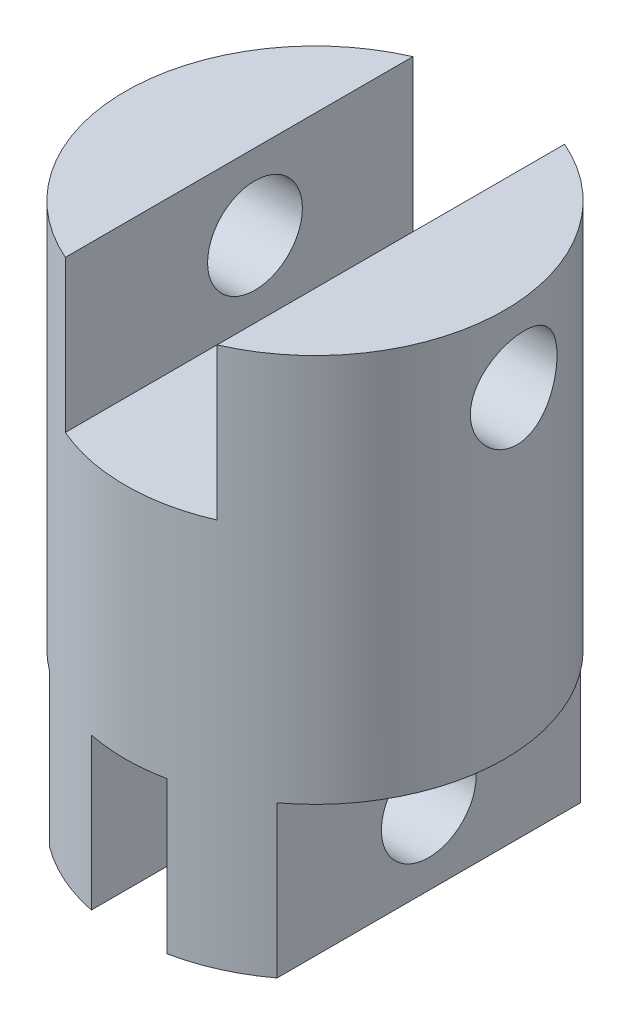
ISO-10303-21;
HEADER;
FILE_DESCRIPTION(('STEP AP214'),'2;1');
FILE_NAME('part.step','',(''),(''),'','','');
FILE_SCHEMA(('AUTOMOTIVE_DESIGN { 1 0 10303 214 1 1 1 1 }'));
ENDSEC;
DATA;
#1=APPLICATION_CONTEXT('core data for automotive mechanical design processes');
#2=APPLICATION_PROTOCOL_DEFINITION('international standard','automotive_design',2000,#1);
#3=PRODUCT_CONTEXT('',#1,'mechanical');
#4=PRODUCT('Part','Part','',(#3));
#5=PRODUCT_RELATED_PRODUCT_CATEGORY('part','',(#4));
#6=PRODUCT_DEFINITION_FORMATION('','',#4);
#7=PRODUCT_DEFINITION_CONTEXT('part definition',#1,'design');
#8=PRODUCT_DEFINITION('design','',#6,#7);
#9=PRODUCT_DEFINITION_SHAPE('','',#8);
#10=(LENGTH_UNIT() NAMED_UNIT(*) SI_UNIT(.MILLI.,.METRE.));
#11=(NAMED_UNIT(*) PLANE_ANGLE_UNIT() SI_UNIT($,.RADIAN.));
#12=(NAMED_UNIT(*) SI_UNIT($,.STERADIAN.) SOLID_ANGLE_UNIT());
#13=UNCERTAINTY_MEASURE_WITH_UNIT(LENGTH_MEASURE(1.E-05),#10,'distance_accuracy_value','');
#14=(GEOMETRIC_REPRESENTATION_CONTEXT(3) GLOBAL_UNCERTAINTY_ASSIGNED_CONTEXT((#13)) GLOBAL_UNIT_ASSIGNED_CONTEXT((#10,
#11,#12)) REPRESENTATION_CONTEXT('',''));
#15=CARTESIAN_POINT('',(0.,0.,0.));
#16=DIRECTION('',(0.,0.,1.));
#17=DIRECTION('',(1.,0.,0.));
#18=AXIS2_PLACEMENT_3D('',#15,#16,#17);
#19=CARTESIAN_POINT('',(0.,10.16,0.));
#20=DIRECTION('',(0.,-1.,0.));
#21=DIRECTION('',(0.,0.,-1.));
#22=AXIS2_PLACEMENT_3D('',#19,#20,#21);
#23=PLANE('',#22);
#24=CARTESIAN_POINT('',(0.,10.16,0.));
#25=DIRECTION('',(0.,-1.,0.));
#26=DIRECTION('',(0.,0.,-1.));
#27=AXIS2_PLACEMENT_3D('',#24,#25,#26);
#28=CIRCLE('',#27,2.54);
#29=CARTESIAN_POINT('',(2.54,10.16,0.));
#30=VERTEX_POINT('',#29);
#31=CARTESIAN_POINT('',(-2.54,10.16,0.));
#32=VERTEX_POINT('',#31);
#33=EDGE_CURVE('E57',#30,#32,#28,.T.);
#34=ORIENTED_EDGE('',*,*,#33,.F.);
#35=DIRECTION('',(0.,0.,1.));
#36=VECTOR('',#35,1.);
#37=CARTESIAN_POINT('',(2.54,10.16,12.4434078933385));
#38=LINE('',#37,#36);
#39=CARTESIAN_POINT('',(2.54,10.16,12.4434078933385));
#40=VERTEX_POINT('',#39);
#41=EDGE_CURVE('E148',#30,#40,#38,.T.);
#42=ORIENTED_EDGE('',*,*,#41,.T.);
#43=CARTESIAN_POINT('',(0.,10.16,0.));
#44=DIRECTION('',(0.,-1.,0.));
#45=DIRECTION('',(0.,0.,-1.));
#46=AXIS2_PLACEMENT_3D('',#43,#44,#45);
#47=CIRCLE('',#46,12.7);
#48=CARTESIAN_POINT('',(-2.54,10.16,12.4434078933385));
#49=VERTEX_POINT('',#48);
#50=EDGE_CURVE('E180',#40,#49,#47,.T.);
#51=ORIENTED_EDGE('',*,*,#50,.T.);
#52=DIRECTION('',(0.,0.,-1.));
#53=VECTOR('',#52,1.);
#54=CARTESIAN_POINT('',(-2.54,10.16,12.4434078933385));
#55=LINE('',#54,#53);
#56=EDGE_CURVE('E150',#49,#32,#55,.T.);
#57=ORIENTED_EDGE('',*,*,#56,.T.);
#58=EDGE_LOOP('',(#34,#42,#51,#57));
#59=FACE_BOUND('',#58,.T.);
#60=ADVANCED_FACE('F39',(#59),#23,.T.);
#61=CARTESIAN_POINT('',(0.,0.,0.));
#62=DIRECTION('',(0.,1.,0.));
#63=DIRECTION('',(0.,0.,1.));
#64=AXIS2_PLACEMENT_3D('',#61,#62,#63);
#65=PLANE('',#64);
#66=CARTESIAN_POINT('',(0.,0.,0.));
#67=DIRECTION('',(0.,1.,0.));
#68=DIRECTION('',(0.,0.,1.));
#69=AXIS2_PLACEMENT_3D('',#66,#67,#68);
#70=CIRCLE('',#69,12.7);
#71=CARTESIAN_POINT('',(7.62,0.,-10.16));
#72=VERTEX_POINT('',#71);
#73=CARTESIAN_POINT('',(2.54,0.,-12.4434078933385));
#74=VERTEX_POINT('',#73);
#75=EDGE_CURVE('E228',#72,#74,#70,.T.);
#76=ORIENTED_EDGE('',*,*,#75,.F.);
#77=DIRECTION('',(0.,0.,-1.));
#78=VECTOR('',#77,1.);
#79=CARTESIAN_POINT('',(7.62,0.,10.16));
#80=LINE('',#79,#78);
#81=CARTESIAN_POINT('',(7.62,0.,10.16));
#82=VERTEX_POINT('',#81);
#83=EDGE_CURVE('E462',#82,#72,#80,.T.);
#84=ORIENTED_EDGE('',*,*,#83,.F.);
#85=CARTESIAN_POINT('',(2.54,0.,12.4434078933385));
#86=VERTEX_POINT('',#85);
#87=EDGE_CURVE('E225',#86,#82,#70,.T.);
#88=ORIENTED_EDGE('',*,*,#87,.F.);
#89=DIRECTION('',(0.,0.,1.));
#90=VECTOR('',#89,1.);
#91=CARTESIAN_POINT('',(2.54,0.,12.4434078933385));
#92=LINE('',#91,#90);
#93=EDGE_CURVE('E176',#74,#86,#92,.T.);
#94=ORIENTED_EDGE('',*,*,#93,.F.);
#95=EDGE_LOOP('',(#76,#84,#88,#94));
#96=FACE_BOUND('',#95,.T.);
#97=ADVANCED_FACE('F321',(#96),#65,.F.);
#98=CARTESIAN_POINT('',(0.,36.195,0.));
#99=DIRECTION('',(0.,1.,0.));
#100=DIRECTION('',(0.,0.,1.));
#101=AXIS2_PLACEMENT_3D('',#98,#99,#100);
#102=PLANE('',#101);
#103=DIRECTION('',(0.,0.,-1.));
#104=VECTOR('',#103,1.);
#105=CARTESIAN_POINT('',(5.08,36.195,-11.6397422651878));
#106=LINE('',#105,#104);
#107=CARTESIAN_POINT('',(5.08,36.195,11.6397422651878));
#108=VERTEX_POINT('',#107);
#109=CARTESIAN_POINT('',(5.08,36.195,-11.6397422651878));
#110=VERTEX_POINT('',#109);
#111=EDGE_CURVE('E195',#108,#110,#106,.T.);
#112=ORIENTED_EDGE('',*,*,#111,.F.);
#113=CARTESIAN_POINT('',(0.,36.195,0.));
#114=DIRECTION('',(0.,1.,0.));
#115=DIRECTION('',(0.,0.,1.));
#116=AXIS2_PLACEMENT_3D('',#113,#114,#115);
#117=CIRCLE('',#116,12.7);
#118=EDGE_CURVE('E11',#108,#110,#117,.T.);
#119=ORIENTED_EDGE('',*,*,#118,.T.);
#120=EDGE_LOOP('',(#112,#119));
#121=FACE_BOUND('',#120,.T.);
#122=ADVANCED_FACE('F318',(#121),#102,.T.);
#123=CARTESIAN_POINT('',(0.,36.195,0.));
#124=DIRECTION('',(0.,-1.,0.));
#125=DIRECTION('',(0.,0.,-1.));
#126=AXIS2_PLACEMENT_3D('',#123,#124,#125);
#127=CYLINDRICAL_SURFACE('',#126,12.7);
#128=CARTESIAN_POINT('',(-11.9729942754398,31.115,-4.23525773481216));
#129=CARTESIAN_POINT('',(-11.972998143231,31.2874088699792,-4.23525262688047));
#130=CARTESIAN_POINT('',(-11.9780095636609,31.4598716387249,-4.22116033774055));
#131=CARTESIAN_POINT('',(-11.9975381000863,31.7997584861729,-4.16532368016898));
#132=CARTESIAN_POINT('',(-12.0120610453909,31.9671794090304,-4.12356235408763));
#133=CARTESIAN_POINT('',(-12.0491026709913,32.2919317790422,-4.01402947263172));
#134=CARTESIAN_POINT('',(-12.0716053634372,32.4492826632751,-3.94630990417966));
#135=CARTESIAN_POINT('',(-12.1225134772368,32.7503390160573,-3.78703436072692));
#136=CARTESIAN_POINT('',(-12.1509195001857,32.8940430917147,-3.69547595612358));
#137=CARTESIAN_POINT('',(-12.2122375809538,33.1691029113475,-3.48760053710267));
#138=CARTESIAN_POINT('',(-12.2452690772457,33.2998806252469,-3.37055424702534));
#139=CARTESIAN_POINT('',(-12.3123252460539,33.5403286539601,-3.11670719723422));
#140=CARTESIAN_POINT('',(-12.3463501304767,33.6499944267882,-2.97990219772202));
#141=CARTESIAN_POINT('',(-12.4140105681662,33.8491575820938,-2.68442175676774));
#142=CARTESIAN_POINT('',(-12.4475844555828,33.9377519929203,-2.52512166018005));
#143=CARTESIAN_POINT('',(-12.5103683585746,34.0866406837887,-2.19299145152488));
#144=CARTESIAN_POINT('',(-12.5395787008088,34.1469370829698,-2.02016235372833));
#145=CARTESIAN_POINT('',(-12.5912063595523,34.2364781383189,-1.66815006049136));
#146=CARTESIAN_POINT('',(-12.6137091771629,34.2661266877327,-1.48908253104349));
#147=CARTESIAN_POINT('',(-12.6511326430744,34.2944481565371,-1.1277414626017));
#148=CARTESIAN_POINT('',(-12.6660551405096,34.2931286339528,-0.945468716719796));
#149=CARTESIAN_POINT('',(-12.687502188702,34.2598511538941,-0.589839174381925));
#150=CARTESIAN_POINT('',(-12.6943071431202,34.2289870590439,-0.416396168961094));
#151=CARTESIAN_POINT('',(-12.7009025881474,34.1389764996355,-0.0768813485584305));
#152=CARTESIAN_POINT('',(-12.7006934320317,34.0798314596344,0.0891908372431004));
#153=CARTESIAN_POINT('',(-12.6944494619133,33.9357231123991,0.407517676618822));
#154=CARTESIAN_POINT('',(-12.6884746565015,33.8510319251207,0.559897000299652));
#155=CARTESIAN_POINT('',(-12.6724411871112,33.6580173315897,0.848629743854683));
#156=CARTESIAN_POINT('',(-12.6623820966837,33.5496914581356,0.984981488337508));
#157=CARTESIAN_POINT('',(-12.6399450023049,33.3101932038052,1.24038360272859));
#158=CARTESIAN_POINT('',(-12.6275283040183,33.1786426207541,1.35907594892826));
#159=CARTESIAN_POINT('',(-12.6026728394593,32.8976575725586,1.57297969164506));
#160=CARTESIAN_POINT('',(-12.5902340715162,32.7482216911472,1.66818922682034));
#161=CARTESIAN_POINT('',(-12.5672199973432,32.4334267897036,1.83359700425444));
#162=CARTESIAN_POINT('',(-12.5566712082812,32.267884979229,1.90345162147138));
#163=CARTESIAN_POINT('',(-12.5393663956625,31.9272224799968,2.01431517082349));
#164=CARTESIAN_POINT('',(-12.5326100674525,31.7521025619015,2.05532642005016));
#165=CARTESIAN_POINT('',(-12.5240252803999,31.3989317891139,2.10700764995979));
#166=CARTESIAN_POINT('',(-12.522153025896,31.2209214875656,2.11794733148771));
#167=CARTESIAN_POINT('',(-12.5235086908234,30.8656030271458,2.10991610891844));
#168=CARTESIAN_POINT('',(-12.5267363756075,30.6882948363465,2.09094658093822));
#169=CARTESIAN_POINT('',(-12.5377268415192,30.3410100405939,2.02398769375489));
#170=CARTESIAN_POINT('',(-12.5454499157718,30.1709830646111,1.97625228912676));
#171=CARTESIAN_POINT('',(-12.5641869147956,29.8413252293486,1.85338715501724));
#172=CARTESIAN_POINT('',(-12.5752011002728,29.6816951948851,1.77825525521383));
#173=CARTESIAN_POINT('',(-12.5988907917401,29.3756564931445,1.60184793217612));
#174=CARTESIAN_POINT('',(-12.6115813872154,29.2293912167403,1.50032579832561));
#175=CARTESIAN_POINT('',(-12.6364209016814,28.9558111156719,1.2742697449463));
#176=CARTESIAN_POINT('',(-12.6485697858979,28.8284975063512,1.14973435075678));
#177=CARTESIAN_POINT('',(-12.6702082162522,28.5953996482611,0.879916130503364));
#178=CARTESIAN_POINT('',(-12.6796754232026,28.4897981524221,0.734473411430738));
#179=CARTESIAN_POINT('',(-12.6937232389071,28.30453513765,0.427697125983251));
#180=CARTESIAN_POINT('',(-12.6983044337287,28.2248705084367,0.266365467992195));
#181=CARTESIAN_POINT('',(-12.7008980430661,28.094824968811,-0.0650697601117363));
#182=CARTESIAN_POINT('',(-12.6990041825368,28.0440385379158,-0.235013384830995));
#183=CARTESIAN_POINT('',(-12.6878929986898,27.9714548363163,-0.580738734568134));
#184=CARTESIAN_POINT('',(-12.6786765922946,27.9496539369839,-0.756519725995769));
#185=CARTESIAN_POINT('',(-12.6529653817535,27.935600178195,-1.1057164000628));
#186=CARTESIAN_POINT('',(-12.6365960407779,27.9428548441381,-1.27912193352732));
#187=CARTESIAN_POINT('',(-12.59721521882,27.9852707172644,-1.62170024605938));
#188=CARTESIAN_POINT('',(-12.5742033046118,28.0204337448816,-1.79087274826802));
#189=CARTESIAN_POINT('',(-12.5224926694032,28.1179703905291,-2.12267503769202));
#190=CARTESIAN_POINT('',(-12.4937243107253,28.1806897277952,-2.28519204203511));
#191=CARTESIAN_POINT('',(-12.4325932636365,28.3314430144316,-2.59729627846604));
#192=CARTESIAN_POINT('',(-12.4002298338348,28.4194821913372,-2.74688083221638));
#193=CARTESIAN_POINT('',(-12.3330308914859,28.6221011764706,-3.03462778093435));
#194=CARTESIAN_POINT('',(-12.2981483693459,28.7375166716735,-3.17219133352036));
#195=CARTESIAN_POINT('',(-12.2298307621258,28.9900965872704,-3.42615995674051));
#196=CARTESIAN_POINT('',(-12.1963960793602,29.1272670040099,-3.54255917477123));
#197=CARTESIAN_POINT('',(-12.1335200021671,29.4219016201651,-3.75231479730335));
#198=CARTESIAN_POINT('',(-12.1041368862798,29.5796089122513,-3.84534814010752));
#199=CARTESIAN_POINT('',(-12.0528509525061,29.9095931028246,-4.00321468640624));
#200=CARTESIAN_POINT('',(-12.030940906053,30.081855719757,-4.06807515772458));
#201=CARTESIAN_POINT('',(-12.0006301947048,30.3975903861465,-4.15650574206976));
#202=CARTESIAN_POINT('',(-11.9903349869687,30.5392581586002,-4.18596434639092));
#203=CARTESIAN_POINT('',(-11.9765158960221,30.825604922851,-4.22534106682629));
#204=CARTESIAN_POINT('',(-11.9729910288939,30.970283474009,-4.23526202230693));
#205=CARTESIAN_POINT('',(-11.9729942754398,31.115,-4.23525773481216));
#206=B_SPLINE_CURVE_WITH_KNOTS('',3,(#128,#129,#130,#131,#132,#133,#134,#135,#136,#137,#138,
#139,#140,#141,#142,#143,#144,#145,#146,#147,#148,#149,#150,#151,#152,#153,#154,#155,#156,#157,
#158,#159,#160,#161,#162,#163,#164,#165,#166,#167,#168,#169,#170,#171,#172,#173,#174,#175,#176,
#177,#178,#179,#180,#181,#182,#183,#184,#185,#186,#187,#188,#189,#190,#191,#192,#193,#194,#195,
#196,#197,#198,#199,#200,#201,#202,#203,#204,#205),.UNSPECIFIED.,.T.,.F.,(4,2,2,2,2,2,2,2,2,2,2,
2,2,2,2,2,2,2,2,2,2,2,2,2,2,2,2,2,2,2,2,2,2,2,2,2,2,2,4),(0.,0.516685442722757,1.03368784210839,
1.54966019823545,2.06568516174838,2.59906942859475,3.13256831886256,3.68593121279239,
4.23925266069452,4.78518541322278,5.33098492753712,5.85732801387331,6.38364459024897,
6.90454171957706,7.42549325087814,7.95587865801775,8.48630609213286,9.02367514821774,
9.56100103058096,10.0934918632431,10.6259581968198,11.1537912344129,11.6816660954809,
12.2146653543448,12.7476987789798,13.2850500469275,13.8223368533809,14.3518796785743,
14.881356205347,15.4018967209428,15.9224711936572,16.4497720436397,16.9771818384299,
17.523430357678,18.0698297028281,18.6234125385423,19.1764583747285,19.6102167497306,
20.0439120828648),.UNSPECIFIED.);
#207=CARTESIAN_POINT('',(-11.9729942754398,31.115,-4.23525773481216));
#208=VERTEX_POINT('',#207);
#209=EDGE_CURVE('E261',#208,#208,#206,.T.);
#210=ORIENTED_EDGE('',*,*,#209,.T.);
#211=EDGE_LOOP('',(#210));
#212=FACE_BOUND('',#211,.T.);
#213=CARTESIAN_POINT('',(11.9729942754398,31.115,-4.23525773481216));
#214=CARTESIAN_POINT('',(11.972998143231,30.9425911300207,-4.23525262688047));
#215=CARTESIAN_POINT('',(11.9780095636609,30.7701283612751,-4.22116033774055));
#216=CARTESIAN_POINT('',(11.9975381000863,30.4302415138271,-4.16532368016898));
#217=CARTESIAN_POINT('',(12.0120610453909,30.2628205909696,-4.12356235408763));
#218=CARTESIAN_POINT('',(12.0491026709913,29.9380682209578,-4.01402947263172));
#219=CARTESIAN_POINT('',(12.0716053634372,29.7807173367249,-3.94630990417966));
#220=CARTESIAN_POINT('',(12.1225134772368,29.4796609839427,-3.78703436072692));
#221=CARTESIAN_POINT('',(12.1509195001857,29.3359569082853,-3.69547595612358));
#222=CARTESIAN_POINT('',(12.2122375809538,29.0608970886524,-3.48760053710267));
#223=CARTESIAN_POINT('',(12.2452690772457,28.9301193747531,-3.37055424702534));
#224=CARTESIAN_POINT('',(12.3123252460539,28.6896713460399,-3.11670719723422));
#225=CARTESIAN_POINT('',(12.3463501304767,28.5800055732118,-2.97990219772201));
#226=CARTESIAN_POINT('',(12.4140105681662,28.3808424179062,-2.68442175676773));
#227=CARTESIAN_POINT('',(12.4475844555827,28.2922480070797,-2.52512166018005));
#228=CARTESIAN_POINT('',(12.5103683585746,28.1433593162113,-2.19299145152487));
#229=CARTESIAN_POINT('',(12.5395787008088,28.0830629170302,-2.02016235372833));
#230=CARTESIAN_POINT('',(12.5912063595523,27.9935218616811,-1.66815006049135));
#231=CARTESIAN_POINT('',(12.6137091771629,27.9638733122673,-1.48908253104349));
#232=CARTESIAN_POINT('',(12.6511326430744,27.9355518434629,-1.1277414626017));
#233=CARTESIAN_POINT('',(12.6660551405096,27.9368713660472,-0.945468716719795));
#234=CARTESIAN_POINT('',(12.687502188702,27.9701488461059,-0.589839174381924));
#235=CARTESIAN_POINT('',(12.6943071431202,28.0010129409561,-0.416396168961093));
#236=CARTESIAN_POINT('',(12.7009025881474,28.0910235003645,-0.0768813485584297));
#237=CARTESIAN_POINT('',(12.7006934320317,28.1501685403656,0.0891908372431007));
#238=CARTESIAN_POINT('',(12.6944494619133,28.2942768876009,0.407517676618824));
#239=CARTESIAN_POINT('',(12.6884746565015,28.3789680748793,0.559897000299655));
#240=CARTESIAN_POINT('',(12.6724411871112,28.5719826684103,0.848629743854685));
#241=CARTESIAN_POINT('',(12.6623820966837,28.6803085418644,0.984981488337508));
#242=CARTESIAN_POINT('',(12.6399450023049,28.9198067961948,1.24038360272859));
#243=CARTESIAN_POINT('',(12.6275283040183,29.0513573792459,1.35907594892826));
#244=CARTESIAN_POINT('',(12.6026728394593,29.3323424274414,1.57297969164506));
#245=CARTESIAN_POINT('',(12.5902340715162,29.4817783088527,1.66818922682034));
#246=CARTESIAN_POINT('',(12.5672199973432,29.7965732102964,1.83359700425444));
#247=CARTESIAN_POINT('',(12.5566712082812,29.962115020771,1.90345162147138));
#248=CARTESIAN_POINT('',(12.5393663956625,30.3027775200032,2.01431517082349));
#249=CARTESIAN_POINT('',(12.5326100674525,30.4778974380985,2.05532642005016));
#250=CARTESIAN_POINT('',(12.5240252803999,30.8310682108861,2.10700764995979));
#251=CARTESIAN_POINT('',(12.522153025896,31.0090785124344,2.11794733148771));
#252=CARTESIAN_POINT('',(12.5235086908234,31.3643969728542,2.10991610891844));
#253=CARTESIAN_POINT('',(12.5267363756075,31.5417051636535,2.09094658093822));
#254=CARTESIAN_POINT('',(12.5377268415192,31.888989959406,2.02398769375489));
#255=CARTESIAN_POINT('',(12.5454499157718,32.0590169353889,1.97625228912676));
#256=CARTESIAN_POINT('',(12.5641869147957,32.3886747706514,1.85338715501724));
#257=CARTESIAN_POINT('',(12.5752011002728,32.5483048051149,1.77825525521383));
#258=CARTESIAN_POINT('',(12.5988907917401,32.8543435068555,1.60184793217612));
#259=CARTESIAN_POINT('',(12.6115813872154,33.0006087832597,1.50032579832561));
#260=CARTESIAN_POINT('',(12.6364209016814,33.2741888843281,1.2742697449463));
#261=CARTESIAN_POINT('',(12.6485697858979,33.4015024936488,1.14973435075678));
#262=CARTESIAN_POINT('',(12.6702082162522,33.6346003517389,0.879916130503366));
#263=CARTESIAN_POINT('',(12.6796754232026,33.7402018475779,0.734473411430739));
#264=CARTESIAN_POINT('',(12.6937232389071,33.9254648623499,0.42769712598325));
#265=CARTESIAN_POINT('',(12.6983044337287,34.0051294915633,0.266365467992193));
#266=CARTESIAN_POINT('',(12.7008980430661,34.135175031189,-0.0650697601117397));
#267=CARTESIAN_POINT('',(12.6990041825368,34.1859614620841,-0.235013384830999));
#268=CARTESIAN_POINT('',(12.6878929986898,34.2585451636836,-0.580738734568137));
#269=CARTESIAN_POINT('',(12.6786765922946,34.2803460630161,-0.756519725995771));
#270=CARTESIAN_POINT('',(12.6529653817535,34.2943998218049,-1.1057164000628));
#271=CARTESIAN_POINT('',(12.6365960407779,34.2871451558619,-1.27912193352732));
#272=CARTESIAN_POINT('',(12.59721521882,34.2447292827356,-1.62170024605938));
#273=CARTESIAN_POINT('',(12.5742033046118,34.2095662551184,-1.79087274826802));
#274=CARTESIAN_POINT('',(12.5224926694032,34.1120296094709,-2.12267503769202));
#275=CARTESIAN_POINT('',(12.4937243107253,34.0493102722048,-2.28519204203511));
#276=CARTESIAN_POINT('',(12.4325932636365,33.8985569855684,-2.59729627846604));
#277=CARTESIAN_POINT('',(12.4002298338348,33.8105178086628,-2.74688083221638));
#278=CARTESIAN_POINT('',(12.3330308914859,33.6078988235294,-3.03462778093435));
#279=CARTESIAN_POINT('',(12.2981483693459,33.4924833283265,-3.17219133352037));
#280=CARTESIAN_POINT('',(12.2298307621258,33.2399034127296,-3.42615995674051));
#281=CARTESIAN_POINT('',(12.1963960793602,33.1027329959901,-3.54255917477123));
#282=CARTESIAN_POINT('',(12.1335200021671,32.8080983798349,-3.75231479730335));
#283=CARTESIAN_POINT('',(12.1041368862798,32.6503910877487,-3.84534814010752));
#284=CARTESIAN_POINT('',(12.0528509525061,32.3204068971754,-4.00321468640624));
#285=CARTESIAN_POINT('',(12.030940906053,32.148144280243,-4.06807515772458));
#286=CARTESIAN_POINT('',(12.0006301947048,31.8324096138535,-4.15650574206976));
#287=CARTESIAN_POINT('',(11.9903349869687,31.6907418413998,-4.18596434639092));
#288=CARTESIAN_POINT('',(11.9765158960221,31.404395077149,-4.22534106682629));
#289=CARTESIAN_POINT('',(11.9729910288939,31.259716525991,-4.23526202230693));
#290=CARTESIAN_POINT('',(11.9729942754398,31.115,-4.23525773481216));
#291=B_SPLINE_CURVE_WITH_KNOTS('',3,(#213,#214,#215,#216,#217,#218,#219,#220,#221,#222,#223,
#224,#225,#226,#227,#228,#229,#230,#231,#232,#233,#234,#235,#236,#237,#238,#239,#240,#241,#242,
#243,#244,#245,#246,#247,#248,#249,#250,#251,#252,#253,#254,#255,#256,#257,#258,#259,#260,#261,
#262,#263,#264,#265,#266,#267,#268,#269,#270,#271,#272,#273,#274,#275,#276,#277,#278,#279,#280,
#281,#282,#283,#284,#285,#286,#287,#288,#289,#290),.UNSPECIFIED.,.T.,.F.,(4,2,2,2,2,2,2,2,2,2,2,
2,2,2,2,2,2,2,2,2,2,2,2,2,2,2,2,2,2,2,2,2,2,2,2,2,2,2,4),(0.,0.516685442722757,1.03368784210839,
1.54966019823544,2.06568516174838,2.59906942859475,3.13256831886256,3.68593121279239,
4.23925266069452,4.78518541322278,5.33098492753712,5.85732801387331,6.38364459024897,
6.90454171957706,7.42549325087815,7.95587865801776,8.48630609213286,9.02367514821774,
9.56100103058096,10.0934918632431,10.6259581968198,11.1537912344129,11.6816660954809,
12.2146653543448,12.7476987789798,13.2850500469275,13.8223368533809,14.3518796785743,
14.881356205347,15.4018967209428,15.9224711936572,16.4497720436397,16.9771818384299,
17.523430357678,18.0698297028282,18.6234125385423,19.1764583747285,19.6102167497306,
20.0439120828648),.UNSPECIFIED.);
#292=CARTESIAN_POINT('',(11.9729942754398,31.115,-4.23525773481216));
#293=VERTEX_POINT('',#292);
#294=EDGE_CURVE('E253',#293,#293,#291,.T.);
#295=ORIENTED_EDGE('',*,*,#294,.T.);
#296=EDGE_LOOP('',(#295));
#297=FACE_BOUND('',#296,.T.);
#298=CARTESIAN_POINT('',(0.,10.16,0.));
#299=DIRECTION('',(0.,-1.,0.));
#300=DIRECTION('',(0.,0.,-1.));
#301=AXIS2_PLACEMENT_3D('',#298,#299,#300);
#302=CIRCLE('',#301,12.7);
#303=CARTESIAN_POINT('',(7.62,10.16,-10.16));
#304=VERTEX_POINT('',#303);
#305=CARTESIAN_POINT('',(7.62,10.16,10.16));
#306=VERTEX_POINT('',#305);
#307=EDGE_CURVE('E419',#304,#306,#302,.T.);
#308=ORIENTED_EDGE('',*,*,#307,.F.);
#309=DIRECTION('',(0.,-1.,0.));
#310=VECTOR('',#309,1.);
#311=CARTESIAN_POINT('',(7.62,10.16,-10.16));
#312=LINE('',#311,#310);
#313=EDGE_CURVE('E458',#304,#72,#312,.T.);
#314=ORIENTED_EDGE('',*,*,#313,.T.);
#315=ORIENTED_EDGE('',*,*,#75,.T.);
#316=DIRECTION('',(0.,-1.,0.));
#317=VECTOR('',#316,1.);
#318=CARTESIAN_POINT('',(2.54,10.16,-12.4434078933385));
#319=LINE('',#318,#317);
#320=CARTESIAN_POINT('',(2.54,10.16,-12.4434078933385));
#321=VERTEX_POINT('',#320);
#322=EDGE_CURVE('E184',#321,#74,#319,.T.);
#323=ORIENTED_EDGE('',*,*,#322,.F.);
#324=CARTESIAN_POINT('',(0.,10.16,0.));
#325=DIRECTION('',(0.,-1.,0.));
#326=DIRECTION('',(0.,0.,-1.));
#327=AXIS2_PLACEMENT_3D('',#324,#325,#326);
#328=CIRCLE('',#327,12.7);
#329=CARTESIAN_POINT('',(-2.54,10.16,-12.4434078933385));
#330=VERTEX_POINT('',#329);
#331=EDGE_CURVE('E162',#330,#321,#328,.T.);
#332=ORIENTED_EDGE('',*,*,#331,.F.);
#333=DIRECTION('',(0.,-1.,0.));
#334=VECTOR('',#333,1.);
#335=CARTESIAN_POINT('',(-2.54,10.16,-12.4434078933385));
#336=LINE('',#335,#334);
#337=CARTESIAN_POINT('',(-2.54,0.,-12.4434078933385));
#338=VERTEX_POINT('',#337);
#339=EDGE_CURVE('E168',#330,#338,#336,.T.);
#340=ORIENTED_EDGE('',*,*,#339,.T.);
#341=CARTESIAN_POINT('',(-7.62,0.,-10.16));
#342=VERTEX_POINT('',#341);
#343=EDGE_CURVE('E437',#338,#342,#70,.T.);
#344=ORIENTED_EDGE('',*,*,#343,.T.);
#345=DIRECTION('',(0.,-1.,0.));
#346=VECTOR('',#345,1.);
#347=CARTESIAN_POINT('',(-7.62,10.16,-10.16));
#348=LINE('',#347,#346);
#349=CARTESIAN_POINT('',(-7.62,10.16,-10.16));
#350=VERTEX_POINT('',#349);
#351=EDGE_CURVE('E470',#350,#342,#348,.T.);
#352=ORIENTED_EDGE('',*,*,#351,.F.);
#353=CARTESIAN_POINT('',(0.,10.16,0.));
#354=DIRECTION('',(0.,-1.,0.));
#355=DIRECTION('',(0.,0.,-1.));
#356=AXIS2_PLACEMENT_3D('',#353,#354,#355);
#357=CIRCLE('',#356,12.7);
#358=CARTESIAN_POINT('',(-7.62,10.16,10.16));
#359=VERTEX_POINT('',#358);
#360=EDGE_CURVE('E478',#359,#350,#357,.T.);
#361=ORIENTED_EDGE('',*,*,#360,.F.);
#362=DIRECTION('',(0.,-1.,0.));
#363=VECTOR('',#362,1.);
#364=CARTESIAN_POINT('',(-7.62,10.16,10.16));
#365=LINE('',#364,#363);
#366=CARTESIAN_POINT('',(-7.62,0.,10.16));
#367=VERTEX_POINT('',#366);
#368=EDGE_CURVE('E177',#359,#367,#365,.T.);
#369=ORIENTED_EDGE('',*,*,#368,.T.);
#370=CARTESIAN_POINT('',(-2.54,0.,12.4434078933385));
#371=VERTEX_POINT('',#370);
#372=EDGE_CURVE('E215',#367,#371,#70,.T.);
#373=ORIENTED_EDGE('',*,*,#372,.T.);
#374=DIRECTION('',(0.,-1.,0.));
#375=VECTOR('',#374,1.);
#376=CARTESIAN_POINT('',(-2.54,10.16,12.4434078933385));
#377=LINE('',#376,#375);
#378=EDGE_CURVE('E65',#49,#371,#377,.T.);
#379=ORIENTED_EDGE('',*,*,#378,.F.);
#380=ORIENTED_EDGE('',*,*,#50,.F.);
#381=DIRECTION('',(0.,-1.,0.));
#382=VECTOR('',#381,1.);
#383=CARTESIAN_POINT('',(2.54,10.16,12.4434078933385));
#384=LINE('',#383,#382);
#385=EDGE_CURVE('E159',#40,#86,#384,.T.);
#386=ORIENTED_EDGE('',*,*,#385,.T.);
#387=ORIENTED_EDGE('',*,*,#87,.T.);
#388=DIRECTION('',(0.,-1.,0.));
#389=VECTOR('',#388,1.);
#390=CARTESIAN_POINT('',(7.62,10.16,10.16));
#391=LINE('',#390,#389);
#392=EDGE_CURVE('E455',#306,#82,#391,.T.);
#393=ORIENTED_EDGE('',*,*,#392,.F.);
#394=EDGE_LOOP('',(#308,#314,#315,#323,#332,#340,#344,#352,#361,#369,#373,#379,#380,#386,#387,#393));
#395=FACE_BOUND('',#394,.T.);
#396=CARTESIAN_POINT('',(0.,26.035,0.));
#397=DIRECTION('',(0.,1.,0.));
#398=DIRECTION('',(0.,0.,1.));
#399=AXIS2_PLACEMENT_3D('',#396,#397,#398);
#400=CIRCLE('',#399,12.7);
#401=CARTESIAN_POINT('',(5.08,26.035,-11.6397422651878));
#402=VERTEX_POINT('',#401);
#403=CARTESIAN_POINT('',(-5.08,26.035,-11.6397422651878));
#404=VERTEX_POINT('',#403);
#405=EDGE_CURVE('E190',#402,#404,#400,.T.);
#406=ORIENTED_EDGE('',*,*,#405,.F.);
#407=DIRECTION('',(0.,1.,0.));
#408=VECTOR('',#407,1.);
#409=CARTESIAN_POINT('',(5.08,26.035,-11.6397422651878));
#410=LINE('',#409,#408);
#411=EDGE_CURVE('E211',#402,#110,#410,.T.);
#412=ORIENTED_EDGE('',*,*,#411,.T.);
#413=ORIENTED_EDGE('',*,*,#118,.F.);
#414=DIRECTION('',(0.,1.,0.));
#415=VECTOR('',#414,1.);
#416=CARTESIAN_POINT('',(5.08,26.035,11.6397422651878));
#417=LINE('',#416,#415);
#418=CARTESIAN_POINT('',(5.08,26.035,11.6397422651878));
#419=VERTEX_POINT('',#418);
#420=EDGE_CURVE('E216',#419,#108,#417,.T.);
#421=ORIENTED_EDGE('',*,*,#420,.F.);
#422=CARTESIAN_POINT('',(0.,26.035,0.));
#423=DIRECTION('',(0.,1.,0.));
#424=DIRECTION('',(0.,0.,1.));
#425=AXIS2_PLACEMENT_3D('',#422,#423,#424);
#426=CIRCLE('',#425,12.7);
#427=CARTESIAN_POINT('',(-5.08,26.035,11.6397422651878));
#428=VERTEX_POINT('',#427);
#429=EDGE_CURVE('E199',#428,#419,#426,.T.);
#430=ORIENTED_EDGE('',*,*,#429,.F.);
#431=DIRECTION('',(0.,1.,0.));
#432=VECTOR('',#431,1.);
#433=CARTESIAN_POINT('',(-5.08,26.035,11.6397422651878));
#434=LINE('',#433,#432);
#435=CARTESIAN_POINT('',(-5.08,36.195,11.6397422651878));
#436=VERTEX_POINT('',#435);
#437=EDGE_CURVE('E219',#428,#436,#434,.T.);
#438=ORIENTED_EDGE('',*,*,#437,.T.);
#439=CARTESIAN_POINT('',(-5.08,36.195,-11.6397422651878));
#440=VERTEX_POINT('',#439);
#441=EDGE_CURVE('E50',#440,#436,#117,.T.);
#442=ORIENTED_EDGE('',*,*,#441,.F.);
#443=DIRECTION('',(0.,1.,0.));
#444=VECTOR('',#443,1.);
#445=CARTESIAN_POINT('',(-5.08,26.035,-11.6397422651878));
#446=LINE('',#445,#444);
#447=EDGE_CURVE('E206',#404,#440,#446,.T.);
#448=ORIENTED_EDGE('',*,*,#447,.F.);
#449=EDGE_LOOP('',(#406,#412,#413,#421,#430,#438,#442,#448));
#450=FACE_BOUND('',#449,.T.);
#451=ADVANCED_FACE('F41',(#212,#297,#395,#450),#127,.T.);
#452=DIRECTION('',(0.,0.,1.));
#453=VECTOR('',#452,1.);
#454=CARTESIAN_POINT('',(-5.08,36.195,-11.6397422651878));
#455=LINE('',#454,#453);
#456=EDGE_CURVE('E183',#440,#436,#455,.T.);
#457=ORIENTED_EDGE('',*,*,#456,.F.);
#458=ORIENTED_EDGE('',*,*,#441,.T.);
#459=EDGE_LOOP('',(#457,#458));
#460=FACE_BOUND('',#459,.T.);
#461=ADVANCED_FACE('F315',(#460),#102,.T.);
#462=ORIENTED_EDGE('',*,*,#372,.F.);
#463=DIRECTION('',(0.,0.,1.));
#464=VECTOR('',#463,1.);
#465=CARTESIAN_POINT('',(-7.62,0.,10.16));
#466=LINE('',#465,#464);
#467=EDGE_CURVE('E445',#342,#367,#466,.T.);
#468=ORIENTED_EDGE('',*,*,#467,.F.);
#469=ORIENTED_EDGE('',*,*,#343,.F.);
#470=DIRECTION('',(0.,0.,-1.));
#471=VECTOR('',#470,1.);
#472=CARTESIAN_POINT('',(-2.54,0.,12.4434078933385));
#473=LINE('',#472,#471);
#474=EDGE_CURVE('E173',#371,#338,#473,.T.);
#475=ORIENTED_EDGE('',*,*,#474,.F.);
#476=EDGE_LOOP('',(#462,#468,#469,#475));
#477=FACE_BOUND('',#476,.T.);
#478=ADVANCED_FACE('F310',(#477),#65,.F.);
#479=CARTESIAN_POINT('',(5.08,26.035,-11.6397422651878));
#480=DIRECTION('',(1.,0.,0.));
#481=DIRECTION('',(0.,0.,-1.));
#482=AXIS2_PLACEMENT_3D('',#479,#480,#481);
#483=PLANE('',#482);
#484=CARTESIAN_POINT('',(5.08,31.115,-1.06025773481217));
#485=DIRECTION('',(1.,0.,0.));
#486=DIRECTION('',(0.,0.,-1.));
#487=AXIS2_PLACEMENT_3D('',#484,#485,#486);
#488=CIRCLE('',#487,3.17499999999999);
#489=CARTESIAN_POINT('',(5.08,31.115,-4.23525773481216));
#490=VERTEX_POINT('',#489);
#491=EDGE_CURVE('E249',#490,#490,#488,.T.);
#492=ORIENTED_EDGE('',*,*,#491,.T.);
#493=EDGE_LOOP('',(#492));
#494=FACE_BOUND('',#493,.T.);
#495=ORIENTED_EDGE('',*,*,#111,.T.);
#496=ORIENTED_EDGE('',*,*,#411,.F.);
#497=DIRECTION('',(0.,0.,-1.));
#498=VECTOR('',#497,1.);
#499=CARTESIAN_POINT('',(5.08,26.035,-11.6397422651878));
#500=LINE('',#499,#498);
#501=EDGE_CURVE('E202',#419,#402,#500,.T.);
#502=ORIENTED_EDGE('',*,*,#501,.F.);
#503=ORIENTED_EDGE('',*,*,#420,.T.);
#504=EDGE_LOOP('',(#495,#496,#502,#503));
#505=FACE_BOUND('',#504,.T.);
#506=ADVANCED_FACE('F307',(#494,#505),#483,.F.);
#507=CARTESIAN_POINT('',(-5.08,26.035,-11.6397422651878));
#508=DIRECTION('',(-1.,0.,0.));
#509=DIRECTION('',(0.,0.,1.));
#510=AXIS2_PLACEMENT_3D('',#507,#508,#509);
#511=PLANE('',#510);
#512=CARTESIAN_POINT('',(-5.08,31.115,-1.06025773481217));
#513=DIRECTION('',(-1.,0.,0.));
#514=DIRECTION('',(0.,0.,1.));
#515=AXIS2_PLACEMENT_3D('',#512,#513,#514);
#516=CIRCLE('',#515,3.17499999999999);
#517=CARTESIAN_POINT('',(-5.08,31.115,2.11474226518783));
#518=VERTEX_POINT('',#517);
#519=EDGE_CURVE('E44',#518,#518,#516,.T.);
#520=ORIENTED_EDGE('',*,*,#519,.T.);
#521=EDGE_LOOP('',(#520));
#522=FACE_BOUND('',#521,.T.);
#523=ORIENTED_EDGE('',*,*,#456,.T.);
#524=ORIENTED_EDGE('',*,*,#437,.F.);
#525=DIRECTION('',(0.,0.,1.));
#526=VECTOR('',#525,1.);
#527=CARTESIAN_POINT('',(-5.08,26.035,-11.6397422651878));
#528=LINE('',#527,#526);
#529=EDGE_CURVE('E194',#404,#428,#528,.T.);
#530=ORIENTED_EDGE('',*,*,#529,.F.);
#531=ORIENTED_EDGE('',*,*,#447,.T.);
#532=EDGE_LOOP('',(#523,#524,#530,#531));
#533=FACE_BOUND('',#532,.T.);
#534=ADVANCED_FACE('F305',(#522,#533),#511,.F.);
#535=CARTESIAN_POINT('',(0.,26.035,0.));
#536=DIRECTION('',(0.,1.,0.));
#537=DIRECTION('',(0.,0.,1.));
#538=AXIS2_PLACEMENT_3D('',#535,#536,#537);
#539=PLANE('',#538);
#540=CARTESIAN_POINT('',(0.,26.035,0.));
#541=DIRECTION('',(0.,1.,0.));
#542=DIRECTION('',(0.,0.,1.));
#543=AXIS2_PLACEMENT_3D('',#540,#541,#542);
#544=CIRCLE('',#543,2.54);
#545=CARTESIAN_POINT('',(0.,26.035,2.54));
#546=VERTEX_POINT('',#545);
#547=EDGE_CURVE('E142',#546,#546,#544,.T.);
#548=ORIENTED_EDGE('',*,*,#547,.F.);
#549=EDGE_LOOP('',(#548));
#550=FACE_BOUND('',#549,.T.);
#551=ORIENTED_EDGE('',*,*,#405,.T.);
#552=ORIENTED_EDGE('',*,*,#529,.T.);
#553=ORIENTED_EDGE('',*,*,#429,.T.);
#554=ORIENTED_EDGE('',*,*,#501,.T.);
#555=EDGE_LOOP('',(#551,#552,#553,#554));
#556=FACE_BOUND('',#555,.T.);
#557=ADVANCED_FACE('F298',(#550,#556),#539,.T.);
#558=CARTESIAN_POINT('',(2.54,10.16,12.4434078933385));
#559=DIRECTION('',(1.,0.,0.));
#560=DIRECTION('',(0.,0.,-1.));
#561=AXIS2_PLACEMENT_3D('',#558,#559,#560);
#562=PLANE('',#561);
#563=CARTESIAN_POINT('',(2.54,5.08,0.));
#564=DIRECTION('',(1.,0.,0.));
#565=DIRECTION('',(0.,0.,-1.));
#566=AXIS2_PLACEMENT_3D('',#563,#564,#565);
#567=CIRCLE('',#566,3.175);
#568=CARTESIAN_POINT('',(2.54,5.08,-3.175));
#569=VERTEX_POINT('',#568);
#570=EDGE_CURVE('E242',#569,#569,#567,.T.);
#571=ORIENTED_EDGE('',*,*,#570,.T.);
#572=EDGE_LOOP('',(#571));
#573=FACE_BOUND('',#572,.T.);
#574=ORIENTED_EDGE('',*,*,#93,.T.);
#575=ORIENTED_EDGE('',*,*,#385,.F.);
#576=ORIENTED_EDGE('',*,*,#41,.F.);
#577=EDGE_CURVE('E156',#321,#30,#38,.T.);
#578=ORIENTED_EDGE('',*,*,#577,.F.);
#579=ORIENTED_EDGE('',*,*,#322,.T.);
#580=EDGE_LOOP('',(#574,#575,#576,#578,#579));
#581=FACE_BOUND('',#580,.T.);
#582=ADVANCED_FACE('F155',(#573,#581),#562,.F.);
#583=CARTESIAN_POINT('',(-2.54,10.16,12.4434078933385));
#584=DIRECTION('',(-1.,0.,0.));
#585=DIRECTION('',(0.,0.,1.));
#586=AXIS2_PLACEMENT_3D('',#583,#584,#585);
#587=PLANE('',#586);
#588=CARTESIAN_POINT('',(-2.54,5.08,0.));
#589=DIRECTION('',(-1.,0.,0.));
#590=DIRECTION('',(0.,0.,1.));
#591=AXIS2_PLACEMENT_3D('',#588,#589,#590);
#592=CIRCLE('',#591,3.175);
#593=CARTESIAN_POINT('',(-2.54,5.08,-3.175));
#594=VERTEX_POINT('',#593);
#595=EDGE_CURVE('E236',#594,#594,#592,.T.);
#596=ORIENTED_EDGE('',*,*,#595,.T.);
#597=EDGE_LOOP('',(#596));
#598=FACE_BOUND('',#597,.T.);
#599=ORIENTED_EDGE('',*,*,#474,.T.);
#600=ORIENTED_EDGE('',*,*,#339,.F.);
#601=EDGE_CURVE('E450',#32,#330,#55,.T.);
#602=ORIENTED_EDGE('',*,*,#601,.F.);
#603=ORIENTED_EDGE('',*,*,#56,.F.);
#604=ORIENTED_EDGE('',*,*,#378,.T.);
#605=EDGE_LOOP('',(#599,#600,#602,#603,#604));
#606=FACE_BOUND('',#605,.T.);
#607=ADVANCED_FACE('F295',(#598,#606),#587,.F.);
#608=EDGE_CURVE('E135',#32,#30,#28,.T.);
#609=ORIENTED_EDGE('',*,*,#608,.F.);
#610=ORIENTED_EDGE('',*,*,#601,.T.);
#611=ORIENTED_EDGE('',*,*,#331,.T.);
#612=ORIENTED_EDGE('',*,*,#577,.T.);
#613=EDGE_LOOP('',(#609,#610,#611,#612));
#614=FACE_BOUND('',#613,.T.);
#615=ADVANCED_FACE('F164',(#614),#23,.T.);
#616=CARTESIAN_POINT('',(-7.62,10.16,10.16));
#617=DIRECTION('',(1.,0.,0.));
#618=DIRECTION('',(0.,0.,-1.));
#619=AXIS2_PLACEMENT_3D('',#616,#617,#618);
#620=PLANE('',#619);
#621=CARTESIAN_POINT('',(-7.62,5.08,0.));
#622=DIRECTION('',(1.,0.,0.));
#623=DIRECTION('',(0.,0.,-1.));
#624=AXIS2_PLACEMENT_3D('',#621,#622,#623);
#625=CIRCLE('',#624,3.175);
#626=CARTESIAN_POINT('',(-7.62,5.08,-3.175));
#627=VERTEX_POINT('',#626);
#628=EDGE_CURVE('E231',#627,#627,#625,.T.);
#629=ORIENTED_EDGE('',*,*,#628,.T.);
#630=EDGE_LOOP('',(#629));
#631=FACE_BOUND('',#630,.T.);
#632=ORIENTED_EDGE('',*,*,#467,.T.);
#633=ORIENTED_EDGE('',*,*,#368,.F.);
#634=DIRECTION('',(0.,0.,1.));
#635=VECTOR('',#634,1.);
#636=CARTESIAN_POINT('',(-7.62,10.16,10.16));
#637=LINE('',#636,#635);
#638=EDGE_CURVE('E473',#350,#359,#637,.T.);
#639=ORIENTED_EDGE('',*,*,#638,.F.);
#640=ORIENTED_EDGE('',*,*,#351,.T.);
#641=EDGE_LOOP('',(#632,#633,#639,#640));
#642=FACE_BOUND('',#641,.T.);
#643=ADVANCED_FACE('F284',(#631,#642),#620,.F.);
#644=CARTESIAN_POINT('',(0.,10.16,0.));
#645=DIRECTION('',(0.,-1.,0.));
#646=DIRECTION('',(0.,0.,-1.));
#647=AXIS2_PLACEMENT_3D('',#644,#645,#646);
#648=PLANE('',#647);
#649=ORIENTED_EDGE('',*,*,#360,.T.);
#650=ORIENTED_EDGE('',*,*,#638,.T.);
#651=EDGE_LOOP('',(#649,#650));
#652=FACE_BOUND('',#651,.T.);
#653=ADVANCED_FACE('F280',(#652),#648,.T.);
#654=CARTESIAN_POINT('',(7.62,10.16,10.16));
#655=DIRECTION('',(-1.,0.,0.));
#656=DIRECTION('',(0.,0.,1.));
#657=AXIS2_PLACEMENT_3D('',#654,#655,#656);
#658=PLANE('',#657);
#659=CARTESIAN_POINT('',(7.62,5.08,0.));
#660=DIRECTION('',(-1.,0.,0.));
#661=DIRECTION('',(0.,0.,1.));
#662=AXIS2_PLACEMENT_3D('',#659,#660,#661);
#663=CIRCLE('',#662,3.175);
#664=CARTESIAN_POINT('',(7.62,5.08,-3.175));
#665=VERTEX_POINT('',#664);
#666=EDGE_CURVE('E152',#665,#665,#663,.T.);
#667=ORIENTED_EDGE('',*,*,#666,.T.);
#668=EDGE_LOOP('',(#667));
#669=FACE_BOUND('',#668,.T.);
#670=ORIENTED_EDGE('',*,*,#83,.T.);
#671=ORIENTED_EDGE('',*,*,#313,.F.);
#672=DIRECTION('',(0.,0.,-1.));
#673=VECTOR('',#672,1.);
#674=CARTESIAN_POINT('',(7.62,10.16,10.16));
#675=LINE('',#674,#673);
#676=EDGE_CURVE('E459',#306,#304,#675,.T.);
#677=ORIENTED_EDGE('',*,*,#676,.F.);
#678=ORIENTED_EDGE('',*,*,#392,.T.);
#679=EDGE_LOOP('',(#670,#671,#677,#678));
#680=FACE_BOUND('',#679,.T.);
#681=ADVANCED_FACE('F283',(#669,#680),#658,.F.);
#682=CARTESIAN_POINT('',(0.,10.16,0.));
#683=DIRECTION('',(0.,-1.,0.));
#684=DIRECTION('',(0.,0.,-1.));
#685=AXIS2_PLACEMENT_3D('',#682,#683,#684);
#686=PLANE('',#685);
#687=ORIENTED_EDGE('',*,*,#307,.T.);
#688=ORIENTED_EDGE('',*,*,#676,.T.);
#689=EDGE_LOOP('',(#687,#688));
#690=FACE_BOUND('',#689,.T.);
#691=ADVANCED_FACE('F278',(#690),#686,.T.);
#692=CARTESIAN_POINT('',(-12.7,5.08,0.));
#693=DIRECTION('',(1.,0.,0.));
#694=DIRECTION('',(0.,0.,-1.));
#695=AXIS2_PLACEMENT_3D('',#692,#693,#694);
#696=CYLINDRICAL_SURFACE('',#695,3.175);
#697=CARTESIAN_POINT('',(7.62,5.08,-3.175));
#698=CARTESIAN_POINT('',(7.56708333333333,5.08,-3.175));
#699=CARTESIAN_POINT('',(7.51416666666667,5.08,-3.175));
#700=CARTESIAN_POINT('',(7.40833333333333,5.08,-3.175));
#701=CARTESIAN_POINT('',(7.35541666666667,5.08,-3.175));
#702=CARTESIAN_POINT('',(7.24958333333333,5.08,-3.175));
#703=CARTESIAN_POINT('',(7.19666666666667,5.08,-3.175));
#704=CARTESIAN_POINT('',(7.09083333333333,5.08,-3.175));
#705=CARTESIAN_POINT('',(7.03791666666667,5.08,-3.175));
#706=CARTESIAN_POINT('',(6.93208333333333,5.08,-3.175));
#707=CARTESIAN_POINT('',(6.87916666666667,5.08,-3.175));
#708=CARTESIAN_POINT('',(6.77333333333333,5.08,-3.175));
#709=CARTESIAN_POINT('',(6.72041666666667,5.08,-3.175));
#710=CARTESIAN_POINT('',(6.61458333333333,5.08,-3.175));
#711=CARTESIAN_POINT('',(6.56166666666667,5.08,-3.175));
#712=CARTESIAN_POINT('',(6.45583333333333,5.08,-3.175));
#713=CARTESIAN_POINT('',(6.40291666666667,5.08,-3.175));
#714=CARTESIAN_POINT('',(6.29708333333333,5.08,-3.175));
#715=CARTESIAN_POINT('',(6.24416666666667,5.08,-3.175));
#716=CARTESIAN_POINT('',(6.13833333333333,5.08,-3.175));
#717=CARTESIAN_POINT('',(6.08541666666667,5.08,-3.175));
#718=CARTESIAN_POINT('',(5.97958333333333,5.08,-3.175));
#719=CARTESIAN_POINT('',(5.92666666666667,5.08,-3.175));
#720=CARTESIAN_POINT('',(5.82083333333333,5.08,-3.175));
#721=CARTESIAN_POINT('',(5.76791666666667,5.08,-3.175));
#722=CARTESIAN_POINT('',(5.66208333333333,5.08,-3.175));
#723=CARTESIAN_POINT('',(5.60916666666667,5.08,-3.175));
#724=CARTESIAN_POINT('',(5.50333333333333,5.08,-3.175));
#725=CARTESIAN_POINT('',(5.45041666666666,5.08,-3.175));
#726=CARTESIAN_POINT('',(5.34458333333333,5.08,-3.175));
#727=CARTESIAN_POINT('',(5.29166666666667,5.08,-3.175));
#728=CARTESIAN_POINT('',(5.18583333333333,5.08,-3.175));
#729=CARTESIAN_POINT('',(5.13291666666667,5.08,-3.175));
#730=CARTESIAN_POINT('',(5.02708333333333,5.08,-3.175));
#731=CARTESIAN_POINT('',(4.97416666666667,5.08,-3.175));
#732=CARTESIAN_POINT('',(4.86833333333333,5.08,-3.175));
#733=CARTESIAN_POINT('',(4.81541666666667,5.08,-3.175));
#734=CARTESIAN_POINT('',(4.70958333333333,5.08,-3.175));
#735=CARTESIAN_POINT('',(4.65666666666667,5.08,-3.175));
#736=CARTESIAN_POINT('',(4.55083333333333,5.08,-3.175));
#737=CARTESIAN_POINT('',(4.49791666666667,5.08,-3.175));
#738=CARTESIAN_POINT('',(4.39208333333333,5.08,-3.175));
#739=CARTESIAN_POINT('',(4.33916666666667,5.08,-3.175));
#740=CARTESIAN_POINT('',(4.23333333333333,5.08,-3.175));
#741=CARTESIAN_POINT('',(4.18041666666667,5.08,-3.175));
#742=CARTESIAN_POINT('',(4.07458333333333,5.08,-3.175));
#743=CARTESIAN_POINT('',(4.02166666666666,5.08,-3.175));
#744=CARTESIAN_POINT('',(3.91583333333333,5.08,-3.175));
#745=CARTESIAN_POINT('',(3.86291666666667,5.08,-3.175));
#746=CARTESIAN_POINT('',(3.75708333333333,5.08,-3.175));
#747=CARTESIAN_POINT('',(3.70416666666667,5.08,-3.175));
#748=CARTESIAN_POINT('',(3.59833333333333,5.08,-3.175));
#749=CARTESIAN_POINT('',(3.54541666666667,5.08,-3.175));
#750=CARTESIAN_POINT('',(3.43958333333333,5.08,-3.175));
#751=CARTESIAN_POINT('',(3.38666666666667,5.08,-3.175));
#752=CARTESIAN_POINT('',(3.28083333333333,5.08,-3.175));
#753=CARTESIAN_POINT('',(3.22791666666667,5.08,-3.175));
#754=CARTESIAN_POINT('',(3.12208333333333,5.08,-3.175));
#755=CARTESIAN_POINT('',(3.06916666666667,5.08,-3.175));
#756=CARTESIAN_POINT('',(2.96333333333333,5.08,-3.175));
#757=CARTESIAN_POINT('',(2.91041666666667,5.08,-3.175));
#758=CARTESIAN_POINT('',(2.80458333333333,5.08,-3.175));
#759=CARTESIAN_POINT('',(2.75166666666667,5.08,-3.175));
#760=CARTESIAN_POINT('',(2.64583333333333,5.08,-3.175));
#761=CARTESIAN_POINT('',(2.59291666666667,5.08,-3.175));
#762=CARTESIAN_POINT('',(2.54,5.08,-3.175));
#763=B_SPLINE_CURVE_WITH_KNOTS('',3,(#697,#698,#699,#700,#701,#702,#703,#704,#705,#706,#707,
#708,#709,#710,#711,#712,#713,#714,#715,#716,#717,#718,#719,#720,#721,#722,#723,#724,#725,#726,
#727,#728,#729,#730,#731,#732,#733,#734,#735,#736,#737,#738,#739,#740,#741,#742,#743,#744,#745,
#746,#747,#748,#749,#750,#751,#752,#753,#754,#755,#756,#757,#758,#759,#760,#761,#762),
.UNSPECIFIED.,.F.,.F.,(4,2,2,2,2,2,2,2,2,2,2,2,2,2,2,2,2,2,2,2,2,2,2,2,2,2,2,2,2,2,2,2,4),(0.,
0.158749999999999,0.317499999999998,0.476250000000001,0.635,0.793749999999999,0.952500000000002,
1.11125,1.27,1.42875,1.5875,1.74625,1.905,2.06375,2.2225,2.38125,2.54,2.69875,2.8575,3.01625,
3.175,3.33375,3.4925,3.65125,3.81,3.96875,4.1275,4.28625,4.445,4.60375,4.7625,4.92125,5.08),.UNSPECIFIED.);
#764=EDGE_CURVE('BSEAM274',#665,#569,#763,.T.);
#765=ORIENTED_EDGE('',*,*,#666,.F.);
#766=ORIENTED_EDGE('',*,*,#570,.F.);
#767=ORIENTED_EDGE('',*,*,#764,.T.);
#768=ORIENTED_EDGE('',*,*,#764,.F.);
#769=EDGE_LOOP('',(#765,#767,#766,#768));
#770=FACE_BOUND('',#769,.T.);
#771=ADVANCED_FACE('F274',(#770),#696,.F.);
#772=CARTESIAN_POINT('',(-7.62,5.08,-3.175));
#773=CARTESIAN_POINT('',(-7.56708333333333,5.08,-3.175));
#774=CARTESIAN_POINT('',(-7.51416666666667,5.08,-3.175));
#775=CARTESIAN_POINT('',(-7.40833333333333,5.08,-3.175));
#776=CARTESIAN_POINT('',(-7.35541666666667,5.08,-3.175));
#777=CARTESIAN_POINT('',(-7.24958333333333,5.08,-3.175));
#778=CARTESIAN_POINT('',(-7.19666666666667,5.08,-3.175));
#779=CARTESIAN_POINT('',(-7.09083333333333,5.08,-3.175));
#780=CARTESIAN_POINT('',(-7.03791666666667,5.08,-3.175));
#781=CARTESIAN_POINT('',(-6.93208333333333,5.08,-3.175));
#782=CARTESIAN_POINT('',(-6.87916666666667,5.08,-3.175));
#783=CARTESIAN_POINT('',(-6.77333333333333,5.08,-3.175));
#784=CARTESIAN_POINT('',(-6.72041666666667,5.08,-3.175));
#785=CARTESIAN_POINT('',(-6.61458333333333,5.08,-3.175));
#786=CARTESIAN_POINT('',(-6.56166666666667,5.08,-3.175));
#787=CARTESIAN_POINT('',(-6.45583333333333,5.08,-3.175));
#788=CARTESIAN_POINT('',(-6.40291666666667,5.08,-3.175));
#789=CARTESIAN_POINT('',(-6.29708333333333,5.08,-3.175));
#790=CARTESIAN_POINT('',(-6.24416666666667,5.08,-3.175));
#791=CARTESIAN_POINT('',(-6.13833333333333,5.08,-3.175));
#792=CARTESIAN_POINT('',(-6.08541666666667,5.08,-3.175));
#793=CARTESIAN_POINT('',(-5.97958333333333,5.08,-3.175));
#794=CARTESIAN_POINT('',(-5.92666666666667,5.08,-3.175));
#795=CARTESIAN_POINT('',(-5.82083333333333,5.08,-3.175));
#796=CARTESIAN_POINT('',(-5.76791666666667,5.08,-3.175));
#797=CARTESIAN_POINT('',(-5.66208333333333,5.08,-3.175));
#798=CARTESIAN_POINT('',(-5.60916666666667,5.08,-3.175));
#799=CARTESIAN_POINT('',(-5.50333333333333,5.08,-3.175));
#800=CARTESIAN_POINT('',(-5.45041666666667,5.08,-3.175));
#801=CARTESIAN_POINT('',(-5.34458333333333,5.08,-3.175));
#802=CARTESIAN_POINT('',(-5.29166666666667,5.08,-3.175));
#803=CARTESIAN_POINT('',(-5.18583333333333,5.08,-3.175));
#804=CARTESIAN_POINT('',(-5.13291666666666,5.08,-3.175));
#805=CARTESIAN_POINT('',(-5.02708333333333,5.08,-3.175));
#806=CARTESIAN_POINT('',(-4.97416666666667,5.08,-3.175));
#807=CARTESIAN_POINT('',(-4.86833333333333,5.08,-3.175));
#808=CARTESIAN_POINT('',(-4.81541666666667,5.08,-3.175));
#809=CARTESIAN_POINT('',(-4.70958333333333,5.08,-3.175));
#810=CARTESIAN_POINT('',(-4.65666666666667,5.08,-3.175));
#811=CARTESIAN_POINT('',(-4.55083333333333,5.08,-3.175));
#812=CARTESIAN_POINT('',(-4.49791666666667,5.08,-3.175));
#813=CARTESIAN_POINT('',(-4.39208333333333,5.08,-3.175));
#814=CARTESIAN_POINT('',(-4.33916666666667,5.08,-3.175));
#815=CARTESIAN_POINT('',(-4.23333333333333,5.08,-3.175));
#816=CARTESIAN_POINT('',(-4.18041666666667,5.08,-3.175));
#817=CARTESIAN_POINT('',(-4.07458333333333,5.08,-3.175));
#818=CARTESIAN_POINT('',(-4.02166666666667,5.08,-3.175));
#819=CARTESIAN_POINT('',(-3.91583333333333,5.08,-3.175));
#820=CARTESIAN_POINT('',(-3.86291666666666,5.08,-3.175));
#821=CARTESIAN_POINT('',(-3.75708333333333,5.08,-3.175));
#822=CARTESIAN_POINT('',(-3.70416666666666,5.08,-3.175));
#823=CARTESIAN_POINT('',(-3.59833333333333,5.08,-3.175));
#824=CARTESIAN_POINT('',(-3.54541666666667,5.08,-3.175));
#825=CARTESIAN_POINT('',(-3.43958333333333,5.08,-3.175));
#826=CARTESIAN_POINT('',(-3.38666666666666,5.08,-3.175));
#827=CARTESIAN_POINT('',(-3.28083333333333,5.08,-3.175));
#828=CARTESIAN_POINT('',(-3.22791666666666,5.08,-3.175));
#829=CARTESIAN_POINT('',(-3.12208333333333,5.08,-3.175));
#830=CARTESIAN_POINT('',(-3.06916666666666,5.08,-3.175));
#831=CARTESIAN_POINT('',(-2.96333333333333,5.08,-3.175));
#832=CARTESIAN_POINT('',(-2.91041666666666,5.08,-3.175));
#833=CARTESIAN_POINT('',(-2.80458333333333,5.08,-3.175));
#834=CARTESIAN_POINT('',(-2.75166666666666,5.08,-3.175));
#835=CARTESIAN_POINT('',(-2.64583333333333,5.08,-3.175));
#836=CARTESIAN_POINT('',(-2.59291666666666,5.08,-3.175));
#837=CARTESIAN_POINT('',(-2.54,5.08,-3.175));
#838=B_SPLINE_CURVE_WITH_KNOTS('',3,(#772,#773,#774,#775,#776,#777,#778,#779,#780,#781,#782,
#783,#784,#785,#786,#787,#788,#789,#790,#791,#792,#793,#794,#795,#796,#797,#798,#799,#800,#801,
#802,#803,#804,#805,#806,#807,#808,#809,#810,#811,#812,#813,#814,#815,#816,#817,#818,#819,#820,
#821,#822,#823,#824,#825,#826,#827,#828,#829,#830,#831,#832,#833,#834,#835,#836,#837),
.UNSPECIFIED.,.F.,.F.,(4,2,2,2,2,2,2,2,2,2,2,2,2,2,2,2,2,2,2,2,2,2,2,2,2,2,2,2,2,2,2,2,4),(0.,
0.15875,0.3175,0.47625,0.635,0.793750000000001,0.952500000000001,1.11125,1.27,1.42875,1.5875,
1.74625,1.905,2.06375,2.2225,2.38125,2.54,2.69875,2.8575,3.01625,3.175,3.33375,3.4925,3.65125,
3.81,3.96875,4.1275,4.28625,4.445,4.60375,4.7625,4.92125000000001,5.08),.UNSPECIFIED.);
#839=EDGE_CURVE('BSEAM272',#627,#594,#838,.T.);
#840=ORIENTED_EDGE('',*,*,#628,.F.);
#841=ORIENTED_EDGE('',*,*,#595,.F.);
#842=ORIENTED_EDGE('',*,*,#839,.T.);
#843=ORIENTED_EDGE('',*,*,#839,.F.);
#844=EDGE_LOOP('',(#840,#842,#841,#843));
#845=FACE_BOUND('',#844,.T.);
#846=ADVANCED_FACE('F272',(#845),#696,.F.);
#847=CARTESIAN_POINT('',(-12.7,31.115,-1.06025773481217));
#848=DIRECTION('',(1.,0.,0.));
#849=DIRECTION('',(0.,0.,-1.));
#850=AXIS2_PLACEMENT_3D('',#847,#848,#849);
#851=CYLINDRICAL_SURFACE('',#850,3.17499999999999);
#852=ORIENTED_EDGE('',*,*,#519,.F.);
#853=EDGE_LOOP('',(#852));
#854=FACE_BOUND('',#853,.T.);
#855=ORIENTED_EDGE('',*,*,#209,.F.);
#856=EDGE_LOOP('',(#855));
#857=FACE_BOUND('',#856,.T.);
#858=ADVANCED_FACE('F266',(#854,#857),#851,.F.);
#859=ORIENTED_EDGE('',*,*,#491,.F.);
#860=EDGE_LOOP('',(#859));
#861=FACE_BOUND('',#860,.T.);
#862=ORIENTED_EDGE('',*,*,#294,.F.);
#863=EDGE_LOOP('',(#862));
#864=FACE_BOUND('',#863,.T.);
#865=ADVANCED_FACE('F271',(#861,#864),#851,.F.);
#866=CARTESIAN_POINT('',(0.,0.,0.));
#867=DIRECTION('',(0.,1.,0.));
#868=DIRECTION('',(0.,0.,1.));
#869=AXIS2_PLACEMENT_3D('',#866,#867,#868);
#870=CYLINDRICAL_SURFACE('',#869,2.54);
#871=ORIENTED_EDGE('',*,*,#33,.T.);
#872=ORIENTED_EDGE('',*,*,#608,.T.);
#873=EDGE_LOOP('',(#871,#872));
#874=FACE_BOUND('',#873,.T.);
#875=ORIENTED_EDGE('',*,*,#547,.T.);
#876=EDGE_LOOP('',(#875));
#877=FACE_BOUND('',#876,.T.);
#878=ADVANCED_FACE('F136',(#874,#877),#870,.F.);
#879=CLOSED_SHELL('',(#60,#97,#122,#451,#461,#478,#506,#534,#557,#582,#607,#615,#643,#653,#681,
#691,#771,#846,#858,#865,#878));
#880=MANIFOLD_SOLID_BREP('B2',#879);
#881=ADVANCED_BREP_SHAPE_REPRESENTATION('',(#18,#880),#14);
#882=SHAPE_DEFINITION_REPRESENTATION(#9,#881);
ENDSEC;
END-ISO-10303-21;
